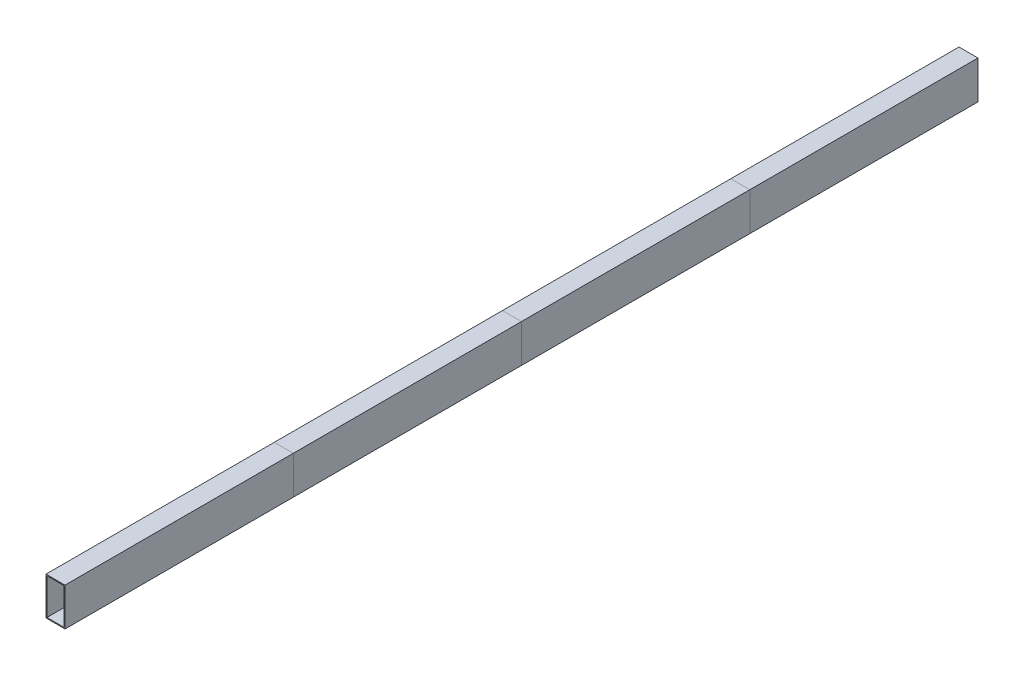
ISO-10303-21;
HEADER;
FILE_DESCRIPTION(('STEP AP214'),'2;1');
FILE_NAME('part.step','',(''),(''),'','','');
FILE_SCHEMA(('AUTOMOTIVE_DESIGN { 1 0 10303 214 1 1 1 1 }'));
ENDSEC;
DATA;
#1=APPLICATION_CONTEXT('core data for automotive mechanical design processes');
#2=APPLICATION_PROTOCOL_DEFINITION('international standard','automotive_design',2000,#1);
#3=PRODUCT_CONTEXT('',#1,'mechanical');
#4=PRODUCT('Part','Part','',(#3));
#5=PRODUCT_RELATED_PRODUCT_CATEGORY('part','',(#4));
#6=PRODUCT_DEFINITION_FORMATION('','',#4);
#7=PRODUCT_DEFINITION_CONTEXT('part definition',#1,'design');
#8=PRODUCT_DEFINITION('design','',#6,#7);
#9=PRODUCT_DEFINITION_SHAPE('','',#8);
#10=(LENGTH_UNIT() NAMED_UNIT(*) SI_UNIT(.MILLI.,.METRE.));
#11=(NAMED_UNIT(*) PLANE_ANGLE_UNIT() SI_UNIT($,.RADIAN.));
#12=(NAMED_UNIT(*) SI_UNIT($,.STERADIAN.) SOLID_ANGLE_UNIT());
#13=UNCERTAINTY_MEASURE_WITH_UNIT(LENGTH_MEASURE(1.E-05),#10,'distance_accuracy_value','');
#14=(GEOMETRIC_REPRESENTATION_CONTEXT(3) GLOBAL_UNCERTAINTY_ASSIGNED_CONTEXT((#13)) GLOBAL_UNIT_ASSIGNED_CONTEXT((#10,
#11,#12)) REPRESENTATION_CONTEXT('',''));
#15=CARTESIAN_POINT('',(0.,0.,0.));
#16=DIRECTION('',(0.,0.,1.));
#17=DIRECTION('',(1.,0.,0.));
#18=AXIS2_PLACEMENT_3D('',#15,#16,#17);
#19=CARTESIAN_POINT('',(0.,0.,4800.));
#20=DIRECTION('',(0.,0.,1.));
#21=DIRECTION('',(1.,0.,0.));
#22=AXIS2_PLACEMENT_3D('',#19,#20,#21);
#23=PLANE('',#22);
#24=DIRECTION('',(0.,1.,0.));
#25=VECTOR('',#24,1.);
#26=CARTESIAN_POINT('',(50.,0.,4800.));
#27=LINE('',#26,#25);
#28=CARTESIAN_POINT('',(50.,-100.,4800.));
#29=VERTEX_POINT('',#28);
#30=CARTESIAN_POINT('',(50.,100.,4800.));
#31=VERTEX_POINT('',#30);
#32=EDGE_CURVE('E150',#29,#31,#27,.T.);
#33=ORIENTED_EDGE('',*,*,#32,.T.);
#34=DIRECTION('',(-1.,0.,0.));
#35=VECTOR('',#34,1.);
#36=CARTESIAN_POINT('',(0.,100.,4800.));
#37=LINE('',#36,#35);
#38=CARTESIAN_POINT('',(-50.,100.,4800.));
#39=VERTEX_POINT('',#38);
#40=EDGE_CURVE('E153',#31,#39,#37,.T.);
#41=ORIENTED_EDGE('',*,*,#40,.T.);
#42=DIRECTION('',(0.,-1.,0.));
#43=VECTOR('',#42,1.);
#44=CARTESIAN_POINT('',(-50.,0.,4800.));
#45=LINE('',#44,#43);
#46=CARTESIAN_POINT('',(-50.,-100.,4800.));
#47=VERTEX_POINT('',#46);
#48=EDGE_CURVE('E156',#39,#47,#45,.T.);
#49=ORIENTED_EDGE('',*,*,#48,.T.);
#50=DIRECTION('',(1.,0.,0.));
#51=VECTOR('',#50,1.);
#52=CARTESIAN_POINT('',(0.,-100.,4800.));
#53=LINE('',#52,#51);
#54=EDGE_CURVE('E158',#47,#29,#53,.T.);
#55=ORIENTED_EDGE('',*,*,#54,.T.);
#56=EDGE_LOOP('',(#33,#41,#49,#55));
#57=FACE_BOUND('',#56,.T.);
#58=DIRECTION('',(-1.,0.,0.));
#59=VECTOR('',#58,1.);
#60=CARTESIAN_POINT('',(0.,95.,4800.));
#61=LINE('',#60,#59);
#62=CARTESIAN_POINT('',(45.,95.,4800.));
#63=VERTEX_POINT('',#62);
#64=CARTESIAN_POINT('',(-45.,95.,4800.));
#65=VERTEX_POINT('',#64);
#66=EDGE_CURVE('E122',#63,#65,#61,.T.);
#67=ORIENTED_EDGE('',*,*,#66,.F.);
#68=DIRECTION('',(0.,1.,0.));
#69=VECTOR('',#68,1.);
#70=CARTESIAN_POINT('',(45.,0.,4800.));
#71=LINE('',#70,#69);
#72=CARTESIAN_POINT('',(45.,-95.,4800.));
#73=VERTEX_POINT('',#72);
#74=EDGE_CURVE('E114',#73,#63,#71,.T.);
#75=ORIENTED_EDGE('',*,*,#74,.F.);
#76=DIRECTION('',(1.,0.,0.));
#77=VECTOR('',#76,1.);
#78=CARTESIAN_POINT('',(0.,-95.,4800.));
#79=LINE('',#78,#77);
#80=CARTESIAN_POINT('',(-45.,-95.,4800.));
#81=VERTEX_POINT('',#80);
#82=EDGE_CURVE('E136',#81,#73,#79,.T.);
#83=ORIENTED_EDGE('',*,*,#82,.F.);
#84=DIRECTION('',(0.,-1.,0.));
#85=VECTOR('',#84,1.);
#86=CARTESIAN_POINT('',(-45.,0.,4800.));
#87=LINE('',#86,#85);
#88=EDGE_CURVE('E134',#65,#81,#87,.T.);
#89=ORIENTED_EDGE('',*,*,#88,.F.);
#90=EDGE_LOOP('',(#67,#75,#83,#89));
#91=FACE_BOUND('',#90,.T.);
#92=ADVANCED_FACE('F49',(#57,#91),#23,.T.);
#93=CARTESIAN_POINT('',(0.,0.,3600.));
#94=DIRECTION('',(0.,0.,1.));
#95=DIRECTION('',(1.,0.,0.));
#96=AXIS2_PLACEMENT_3D('',#93,#94,#95);
#97=PLANE('',#96);
#98=DIRECTION('',(0.,1.,0.));
#99=VECTOR('',#98,1.);
#100=CARTESIAN_POINT('',(50.,0.,3600.));
#101=LINE('',#100,#99);
#102=CARTESIAN_POINT('',(50.,-100.,3600.));
#103=VERTEX_POINT('',#102);
#104=CARTESIAN_POINT('',(50.,100.,3600.));
#105=VERTEX_POINT('',#104);
#106=EDGE_CURVE('E130',#103,#105,#101,.T.);
#107=ORIENTED_EDGE('',*,*,#106,.F.);
#108=DIRECTION('',(1.,0.,0.));
#109=VECTOR('',#108,1.);
#110=CARTESIAN_POINT('',(0.,-100.,3600.));
#111=LINE('',#110,#109);
#112=CARTESIAN_POINT('',(-50.,-100.,3600.));
#113=VERTEX_POINT('',#112);
#114=EDGE_CURVE('E154',#113,#103,#111,.T.);
#115=ORIENTED_EDGE('',*,*,#114,.F.);
#116=DIRECTION('',(0.,-1.,0.));
#117=VECTOR('',#116,1.);
#118=CARTESIAN_POINT('',(-50.,0.,3600.));
#119=LINE('',#118,#117);
#120=CARTESIAN_POINT('',(-50.,100.,3600.));
#121=VERTEX_POINT('',#120);
#122=EDGE_CURVE('E165',#121,#113,#119,.T.);
#123=ORIENTED_EDGE('',*,*,#122,.F.);
#124=DIRECTION('',(-1.,0.,0.));
#125=VECTOR('',#124,1.);
#126=CARTESIAN_POINT('',(0.,100.,3600.));
#127=LINE('',#126,#125);
#128=EDGE_CURVE('E163',#105,#121,#127,.T.);
#129=ORIENTED_EDGE('',*,*,#128,.F.);
#130=EDGE_LOOP('',(#107,#115,#123,#129));
#131=FACE_BOUND('',#130,.T.);
#132=DIRECTION('',(0.,1.,0.));
#133=VECTOR('',#132,1.);
#134=CARTESIAN_POINT('',(45.,0.,3600.));
#135=LINE('',#134,#133);
#136=CARTESIAN_POINT('',(45.,-95.,3600.));
#137=VERTEX_POINT('',#136);
#138=CARTESIAN_POINT('',(45.,95.,3600.));
#139=VERTEX_POINT('',#138);
#140=EDGE_CURVE('E72',#137,#139,#135,.T.);
#141=ORIENTED_EDGE('',*,*,#140,.T.);
#142=DIRECTION('',(-1.,0.,0.));
#143=VECTOR('',#142,1.);
#144=CARTESIAN_POINT('',(0.,95.,3600.));
#145=LINE('',#144,#143);
#146=CARTESIAN_POINT('',(-45.,95.,3600.));
#147=VERTEX_POINT('',#146);
#148=EDGE_CURVE('E129',#139,#147,#145,.T.);
#149=ORIENTED_EDGE('',*,*,#148,.T.);
#150=DIRECTION('',(0.,-1.,0.));
#151=VECTOR('',#150,1.);
#152=CARTESIAN_POINT('',(-45.,0.,3600.));
#153=LINE('',#152,#151);
#154=CARTESIAN_POINT('',(-45.,-95.,3600.));
#155=VERTEX_POINT('',#154);
#156=EDGE_CURVE('E142',#147,#155,#153,.T.);
#157=ORIENTED_EDGE('',*,*,#156,.T.);
#158=DIRECTION('',(1.,0.,0.));
#159=VECTOR('',#158,1.);
#160=CARTESIAN_POINT('',(0.,-95.,3600.));
#161=LINE('',#160,#159);
#162=EDGE_CURVE('E123',#155,#137,#161,.T.);
#163=ORIENTED_EDGE('',*,*,#162,.T.);
#164=EDGE_LOOP('',(#141,#149,#157,#163));
#165=FACE_BOUND('',#164,.T.);
#166=ADVANCED_FACE('F183',(#131,#165),#97,.F.);
#167=CARTESIAN_POINT('',(50.,0.,4800.));
#168=DIRECTION('',(-1.,0.,0.));
#169=DIRECTION('',(0.,0.,1.));
#170=AXIS2_PLACEMENT_3D('',#167,#168,#169);
#171=PLANE('',#170);
#172=ORIENTED_EDGE('',*,*,#106,.T.);
#173=DIRECTION('',(0.,0.,-1.));
#174=VECTOR('',#173,1.);
#175=CARTESIAN_POINT('',(50.,100.,4800.));
#176=LINE('',#175,#174);
#177=EDGE_CURVE('E12',#31,#105,#176,.T.);
#178=ORIENTED_EDGE('',*,*,#177,.F.);
#179=ORIENTED_EDGE('',*,*,#32,.F.);
#180=DIRECTION('',(0.,0.,-1.));
#181=VECTOR('',#180,1.);
#182=CARTESIAN_POINT('',(50.,-100.,4800.));
#183=LINE('',#182,#181);
#184=EDGE_CURVE('E160',#29,#103,#183,.T.);
#185=ORIENTED_EDGE('',*,*,#184,.T.);
#186=EDGE_LOOP('',(#172,#178,#179,#185));
#187=FACE_BOUND('',#186,.T.);
#188=ADVANCED_FACE('F51',(#187),#171,.F.);
#189=CARTESIAN_POINT('',(0.,100.,4800.));
#190=DIRECTION('',(0.,-1.,0.));
#191=DIRECTION('',(0.,0.,-1.));
#192=AXIS2_PLACEMENT_3D('',#189,#190,#191);
#193=PLANE('',#192);
#194=ORIENTED_EDGE('',*,*,#128,.T.);
#195=DIRECTION('',(0.,0.,-1.));
#196=VECTOR('',#195,1.);
#197=CARTESIAN_POINT('',(-50.,100.,4800.));
#198=LINE('',#197,#196);
#199=EDGE_CURVE('E57',#39,#121,#198,.T.);
#200=ORIENTED_EDGE('',*,*,#199,.F.);
#201=ORIENTED_EDGE('',*,*,#40,.F.);
#202=ORIENTED_EDGE('',*,*,#177,.T.);
#203=EDGE_LOOP('',(#194,#200,#201,#202));
#204=FACE_BOUND('',#203,.T.);
#205=ADVANCED_FACE('F193',(#204),#193,.F.);
#206=CARTESIAN_POINT('',(-50.,0.,4800.));
#207=DIRECTION('',(1.,0.,0.));
#208=DIRECTION('',(0.,0.,-1.));
#209=AXIS2_PLACEMENT_3D('',#206,#207,#208);
#210=PLANE('',#209);
#211=ORIENTED_EDGE('',*,*,#122,.T.);
#212=DIRECTION('',(0.,0.,-1.));
#213=VECTOR('',#212,1.);
#214=CARTESIAN_POINT('',(-50.,-100.,4800.));
#215=LINE('',#214,#213);
#216=EDGE_CURVE('E170',#47,#113,#215,.T.);
#217=ORIENTED_EDGE('',*,*,#216,.F.);
#218=ORIENTED_EDGE('',*,*,#48,.F.);
#219=ORIENTED_EDGE('',*,*,#199,.T.);
#220=EDGE_LOOP('',(#211,#217,#218,#219));
#221=FACE_BOUND('',#220,.T.);
#222=ADVANCED_FACE('F177',(#221),#210,.F.);
#223=CARTESIAN_POINT('',(0.,-100.,4800.));
#224=DIRECTION('',(0.,1.,0.));
#225=DIRECTION('',(0.,0.,1.));
#226=AXIS2_PLACEMENT_3D('',#223,#224,#225);
#227=PLANE('',#226);
#228=ORIENTED_EDGE('',*,*,#114,.T.);
#229=ORIENTED_EDGE('',*,*,#184,.F.);
#230=ORIENTED_EDGE('',*,*,#54,.F.);
#231=ORIENTED_EDGE('',*,*,#216,.T.);
#232=EDGE_LOOP('',(#228,#229,#230,#231));
#233=FACE_BOUND('',#232,.T.);
#234=ADVANCED_FACE('F187',(#233),#227,.F.);
#235=CARTESIAN_POINT('',(45.,0.,4800.));
#236=DIRECTION('',(-1.,0.,0.));
#237=DIRECTION('',(0.,0.,1.));
#238=AXIS2_PLACEMENT_3D('',#235,#236,#237);
#239=PLANE('',#238);
#240=ORIENTED_EDGE('',*,*,#140,.F.);
#241=DIRECTION('',(0.,0.,-1.));
#242=VECTOR('',#241,1.);
#243=CARTESIAN_POINT('',(45.,-95.,4800.));
#244=LINE('',#243,#242);
#245=EDGE_CURVE('E118',#73,#137,#244,.T.);
#246=ORIENTED_EDGE('',*,*,#245,.F.);
#247=ORIENTED_EDGE('',*,*,#74,.T.);
#248=DIRECTION('',(0.,0.,-1.));
#249=VECTOR('',#248,1.);
#250=CARTESIAN_POINT('',(45.,95.,4800.));
#251=LINE('',#250,#249);
#252=EDGE_CURVE('E117',#63,#139,#251,.T.);
#253=ORIENTED_EDGE('',*,*,#252,.T.);
#254=EDGE_LOOP('',(#240,#246,#247,#253));
#255=FACE_BOUND('',#254,.T.);
#256=ADVANCED_FACE('F116',(#255),#239,.T.);
#257=CARTESIAN_POINT('',(0.,95.,4800.));
#258=DIRECTION('',(0.,-1.,0.));
#259=DIRECTION('',(0.,0.,-1.));
#260=AXIS2_PLACEMENT_3D('',#257,#258,#259);
#261=PLANE('',#260);
#262=ORIENTED_EDGE('',*,*,#148,.F.);
#263=ORIENTED_EDGE('',*,*,#252,.F.);
#264=ORIENTED_EDGE('',*,*,#66,.T.);
#265=DIRECTION('',(0.,0.,-1.));
#266=VECTOR('',#265,1.);
#267=CARTESIAN_POINT('',(-45.,95.,4800.));
#268=LINE('',#267,#266);
#269=EDGE_CURVE('E131',#65,#147,#268,.T.);
#270=ORIENTED_EDGE('',*,*,#269,.T.);
#271=EDGE_LOOP('',(#262,#263,#264,#270));
#272=FACE_BOUND('',#271,.T.);
#273=ADVANCED_FACE('F126',(#272),#261,.T.);
#274=CARTESIAN_POINT('',(-45.,0.,4800.));
#275=DIRECTION('',(1.,0.,0.));
#276=DIRECTION('',(0.,0.,-1.));
#277=AXIS2_PLACEMENT_3D('',#274,#275,#276);
#278=PLANE('',#277);
#279=ORIENTED_EDGE('',*,*,#156,.F.);
#280=ORIENTED_EDGE('',*,*,#269,.F.);
#281=ORIENTED_EDGE('',*,*,#88,.T.);
#282=DIRECTION('',(0.,0.,-1.));
#283=VECTOR('',#282,1.);
#284=CARTESIAN_POINT('',(-45.,-95.,4800.));
#285=LINE('',#284,#283);
#286=EDGE_CURVE('E64',#81,#155,#285,.T.);
#287=ORIENTED_EDGE('',*,*,#286,.T.);
#288=EDGE_LOOP('',(#279,#280,#281,#287));
#289=FACE_BOUND('',#288,.T.);
#290=ADVANCED_FACE('F216',(#289),#278,.T.);
#291=CARTESIAN_POINT('',(0.,-95.,4800.));
#292=DIRECTION('',(0.,1.,0.));
#293=DIRECTION('',(0.,0.,1.));
#294=AXIS2_PLACEMENT_3D('',#291,#292,#293);
#295=PLANE('',#294);
#296=ORIENTED_EDGE('',*,*,#162,.F.);
#297=ORIENTED_EDGE('',*,*,#286,.F.);
#298=ORIENTED_EDGE('',*,*,#82,.T.);
#299=ORIENTED_EDGE('',*,*,#245,.T.);
#300=EDGE_LOOP('',(#296,#297,#298,#299));
#301=FACE_BOUND('',#300,.T.);
#302=ADVANCED_FACE('F220',(#301),#295,.T.);
#303=CLOSED_SHELL('',(#92,#166,#188,#205,#222,#234,#256,#273,#290,#302));
#304=MANIFOLD_SOLID_BREP('B2',#303);
#305=CARTESIAN_POINT('',(-50.,0.,3600.));
#306=DIRECTION('',(-1.,0.,0.));
#307=DIRECTION('',(0.,0.,1.));
#308=AXIS2_PLACEMENT_3D('',#305,#306,#307);
#309=PLANE('',#308);
#310=DIRECTION('',(0.,1.,0.));
#311=VECTOR('',#310,1.);
#312=CARTESIAN_POINT('',(-50.,0.,2400.));
#313=LINE('',#312,#311);
#314=CARTESIAN_POINT('',(-50.,-100.,2400.));
#315=VERTEX_POINT('',#314);
#316=CARTESIAN_POINT('',(-50.,100.,2400.));
#317=VERTEX_POINT('',#316);
#318=EDGE_CURVE('E386',#315,#317,#313,.T.);
#319=ORIENTED_EDGE('',*,*,#318,.F.);
#320=DIRECTION('',(0.,0.,-1.));
#321=VECTOR('',#320,1.);
#322=CARTESIAN_POINT('',(-50.,-100.,3600.));
#323=LINE('',#322,#321);
#324=CARTESIAN_POINT('',(-50.,-100.,3600.));
#325=VERTEX_POINT('',#324);
#326=EDGE_CURVE('E47',#325,#315,#323,.T.);
#327=ORIENTED_EDGE('',*,*,#326,.F.);
#328=DIRECTION('',(0.,1.,0.));
#329=VECTOR('',#328,1.);
#330=CARTESIAN_POINT('',(-50.,0.,3600.));
#331=LINE('',#330,#329);
#332=CARTESIAN_POINT('',(-50.,100.,3600.));
#333=VERTEX_POINT('',#332);
#334=EDGE_CURVE('E390',#325,#333,#331,.T.);
#335=ORIENTED_EDGE('',*,*,#334,.T.);
#336=DIRECTION('',(0.,0.,-1.));
#337=VECTOR('',#336,1.);
#338=CARTESIAN_POINT('',(-50.,100.,3600.));
#339=LINE('',#338,#337);
#340=EDGE_CURVE('E291',#333,#317,#339,.T.);
#341=ORIENTED_EDGE('',*,*,#340,.T.);
#342=EDGE_LOOP('',(#319,#327,#335,#341));
#343=FACE_BOUND('',#342,.T.);
#344=ADVANCED_FACE('F288',(#343),#309,.T.);
#345=CARTESIAN_POINT('',(0.,-100.,3600.));
#346=DIRECTION('',(0.,-1.,0.));
#347=DIRECTION('',(0.,0.,-1.));
#348=AXIS2_PLACEMENT_3D('',#345,#346,#347);
#349=PLANE('',#348);
#350=DIRECTION('',(-1.,0.,0.));
#351=VECTOR('',#350,1.);
#352=CARTESIAN_POINT('',(0.,-100.,2400.));
#353=LINE('',#352,#351);
#354=CARTESIAN_POINT('',(50.,-100.,2400.));
#355=VERTEX_POINT('',#354);
#356=EDGE_CURVE('E394',#355,#315,#353,.T.);
#357=ORIENTED_EDGE('',*,*,#356,.F.);
#358=DIRECTION('',(0.,0.,-1.));
#359=VECTOR('',#358,1.);
#360=CARTESIAN_POINT('',(50.,-100.,3600.));
#361=LINE('',#360,#359);
#362=CARTESIAN_POINT('',(50.,-100.,3600.));
#363=VERTEX_POINT('',#362);
#364=EDGE_CURVE('E296',#363,#355,#361,.T.);
#365=ORIENTED_EDGE('',*,*,#364,.F.);
#366=DIRECTION('',(-1.,0.,0.));
#367=VECTOR('',#366,1.);
#368=CARTESIAN_POINT('',(0.,-100.,3600.));
#369=LINE('',#368,#367);
#370=EDGE_CURVE('E400',#363,#325,#369,.T.);
#371=ORIENTED_EDGE('',*,*,#370,.T.);
#372=ORIENTED_EDGE('',*,*,#326,.T.);
#373=EDGE_LOOP('',(#357,#365,#371,#372));
#374=FACE_BOUND('',#373,.T.);
#375=ADVANCED_FACE('F426',(#374),#349,.T.);
#376=CARTESIAN_POINT('',(50.,0.,3600.));
#377=DIRECTION('',(1.,0.,0.));
#378=DIRECTION('',(0.,0.,-1.));
#379=AXIS2_PLACEMENT_3D('',#376,#377,#378);
#380=PLANE('',#379);
#381=DIRECTION('',(0.,-1.,0.));
#382=VECTOR('',#381,1.);
#383=CARTESIAN_POINT('',(50.,0.,2400.));
#384=LINE('',#383,#382);
#385=CARTESIAN_POINT('',(50.,100.,2400.));
#386=VERTEX_POINT('',#385);
#387=EDGE_CURVE('E408',#386,#355,#384,.T.);
#388=ORIENTED_EDGE('',*,*,#387,.F.);
#389=DIRECTION('',(0.,0.,-1.));
#390=VECTOR('',#389,1.);
#391=CARTESIAN_POINT('',(50.,100.,3600.));
#392=LINE('',#391,#390);
#393=CARTESIAN_POINT('',(50.,100.,3600.));
#394=VERTEX_POINT('',#393);
#395=EDGE_CURVE('E413',#394,#386,#392,.T.);
#396=ORIENTED_EDGE('',*,*,#395,.F.);
#397=DIRECTION('',(0.,-1.,0.));
#398=VECTOR('',#397,1.);
#399=CARTESIAN_POINT('',(50.,0.,3600.));
#400=LINE('',#399,#398);
#401=EDGE_CURVE('E397',#394,#363,#400,.T.);
#402=ORIENTED_EDGE('',*,*,#401,.T.);
#403=ORIENTED_EDGE('',*,*,#364,.T.);
#404=EDGE_LOOP('',(#388,#396,#402,#403));
#405=FACE_BOUND('',#404,.T.);
#406=ADVANCED_FACE('F430',(#405),#380,.T.);
#407=CARTESIAN_POINT('',(0.,100.,3600.));
#408=DIRECTION('',(0.,1.,0.));
#409=DIRECTION('',(0.,0.,1.));
#410=AXIS2_PLACEMENT_3D('',#407,#408,#409);
#411=PLANE('',#410);
#412=DIRECTION('',(1.,0.,0.));
#413=VECTOR('',#412,1.);
#414=CARTESIAN_POINT('',(0.,100.,2400.));
#415=LINE('',#414,#413);
#416=EDGE_CURVE('E405',#317,#386,#415,.T.);
#417=ORIENTED_EDGE('',*,*,#416,.F.);
#418=ORIENTED_EDGE('',*,*,#340,.F.);
#419=DIRECTION('',(1.,0.,0.));
#420=VECTOR('',#419,1.);
#421=CARTESIAN_POINT('',(0.,100.,3600.));
#422=LINE('',#421,#420);
#423=EDGE_CURVE('E393',#333,#394,#422,.T.);
#424=ORIENTED_EDGE('',*,*,#423,.T.);
#425=ORIENTED_EDGE('',*,*,#395,.T.);
#426=EDGE_LOOP('',(#417,#418,#424,#425));
#427=FACE_BOUND('',#426,.T.);
#428=ADVANCED_FACE('F421',(#427),#411,.T.);
#429=CARTESIAN_POINT('',(0.,0.,3600.));
#430=DIRECTION('',(0.,0.,-1.));
#431=DIRECTION('',(-1.,0.,0.));
#432=AXIS2_PLACEMENT_3D('',#429,#430,#431);
#433=PLANE('',#432);
#434=DIRECTION('',(-1.,0.,0.));
#435=VECTOR('',#434,1.);
#436=CARTESIAN_POINT('',(0.,-95.,3600.));
#437=LINE('',#436,#435);
#438=CARTESIAN_POINT('',(45.,-95.,3600.));
#439=VERTEX_POINT('',#438);
#440=CARTESIAN_POINT('',(-45.,-95.,3600.));
#441=VERTEX_POINT('',#440);
#442=EDGE_CURVE('E361',#439,#441,#437,.T.);
#443=ORIENTED_EDGE('',*,*,#442,.T.);
#444=DIRECTION('',(0.,1.,0.));
#445=VECTOR('',#444,1.);
#446=CARTESIAN_POINT('',(-45.,0.,3600.));
#447=LINE('',#446,#445);
#448=CARTESIAN_POINT('',(-45.,95.,3600.));
#449=VERTEX_POINT('',#448);
#450=EDGE_CURVE('E355',#441,#449,#447,.T.);
#451=ORIENTED_EDGE('',*,*,#450,.T.);
#452=DIRECTION('',(1.,0.,0.));
#453=VECTOR('',#452,1.);
#454=CARTESIAN_POINT('',(0.,95.,3600.));
#455=LINE('',#454,#453);
#456=CARTESIAN_POINT('',(45.,95.,3600.));
#457=VERTEX_POINT('',#456);
#458=EDGE_CURVE('E364',#449,#457,#455,.T.);
#459=ORIENTED_EDGE('',*,*,#458,.T.);
#460=DIRECTION('',(0.,-1.,0.));
#461=VECTOR('',#460,1.);
#462=CARTESIAN_POINT('',(45.,0.,3600.));
#463=LINE('',#462,#461);
#464=EDGE_CURVE('E304',#457,#439,#463,.T.);
#465=ORIENTED_EDGE('',*,*,#464,.T.);
#466=EDGE_LOOP('',(#443,#451,#459,#465));
#467=FACE_BOUND('',#466,.T.);
#468=ORIENTED_EDGE('',*,*,#334,.F.);
#469=ORIENTED_EDGE('',*,*,#370,.F.);
#470=ORIENTED_EDGE('',*,*,#401,.F.);
#471=ORIENTED_EDGE('',*,*,#423,.F.);
#472=EDGE_LOOP('',(#468,#469,#470,#471));
#473=FACE_BOUND('',#472,.T.);
#474=ADVANCED_FACE('F368',(#467,#473),#433,.F.);
#475=CARTESIAN_POINT('',(0.,0.,2400.));
#476=DIRECTION('',(0.,0.,-1.));
#477=DIRECTION('',(-1.,0.,0.));
#478=AXIS2_PLACEMENT_3D('',#475,#476,#477);
#479=PLANE('',#478);
#480=DIRECTION('',(0.,1.,0.));
#481=VECTOR('',#480,1.);
#482=CARTESIAN_POINT('',(-45.,0.,2400.));
#483=LINE('',#482,#481);
#484=CARTESIAN_POINT('',(-45.,-95.,2400.));
#485=VERTEX_POINT('',#484);
#486=CARTESIAN_POINT('',(-45.,95.,2400.));
#487=VERTEX_POINT('',#486);
#488=EDGE_CURVE('E312',#485,#487,#483,.T.);
#489=ORIENTED_EDGE('',*,*,#488,.F.);
#490=DIRECTION('',(-1.,0.,0.));
#491=VECTOR('',#490,1.);
#492=CARTESIAN_POINT('',(0.,-95.,2400.));
#493=LINE('',#492,#491);
#494=CARTESIAN_POINT('',(45.,-95.,2400.));
#495=VERTEX_POINT('',#494);
#496=EDGE_CURVE('E371',#495,#485,#493,.T.);
#497=ORIENTED_EDGE('',*,*,#496,.F.);
#498=DIRECTION('',(0.,-1.,0.));
#499=VECTOR('',#498,1.);
#500=CARTESIAN_POINT('',(45.,0.,2400.));
#501=LINE('',#500,#499);
#502=CARTESIAN_POINT('',(45.,95.,2400.));
#503=VERTEX_POINT('',#502);
#504=EDGE_CURVE('E374',#503,#495,#501,.T.);
#505=ORIENTED_EDGE('',*,*,#504,.F.);
#506=DIRECTION('',(1.,0.,0.));
#507=VECTOR('',#506,1.);
#508=CARTESIAN_POINT('',(0.,95.,2400.));
#509=LINE('',#508,#507);
#510=EDGE_CURVE('E380',#487,#503,#509,.T.);
#511=ORIENTED_EDGE('',*,*,#510,.F.);
#512=EDGE_LOOP('',(#489,#497,#505,#511));
#513=FACE_BOUND('',#512,.T.);
#514=ORIENTED_EDGE('',*,*,#318,.T.);
#515=ORIENTED_EDGE('',*,*,#416,.T.);
#516=ORIENTED_EDGE('',*,*,#387,.T.);
#517=ORIENTED_EDGE('',*,*,#356,.T.);
#518=EDGE_LOOP('',(#514,#515,#516,#517));
#519=FACE_BOUND('',#518,.T.);
#520=ADVANCED_FACE('F423',(#513,#519),#479,.T.);
#521=CARTESIAN_POINT('',(-45.,0.,3600.));
#522=DIRECTION('',(-1.,0.,0.));
#523=DIRECTION('',(0.,0.,1.));
#524=AXIS2_PLACEMENT_3D('',#521,#522,#523);
#525=PLANE('',#524);
#526=ORIENTED_EDGE('',*,*,#488,.T.);
#527=DIRECTION('',(0.,0.,-1.));
#528=VECTOR('',#527,1.);
#529=CARTESIAN_POINT('',(-45.,95.,3600.));
#530=LINE('',#529,#528);
#531=EDGE_CURVE('E351',#449,#487,#530,.T.);
#532=ORIENTED_EDGE('',*,*,#531,.F.);
#533=ORIENTED_EDGE('',*,*,#450,.F.);
#534=DIRECTION('',(0.,0.,-1.));
#535=VECTOR('',#534,1.);
#536=CARTESIAN_POINT('',(-45.,-95.,3600.));
#537=LINE('',#536,#535);
#538=EDGE_CURVE('E384',#441,#485,#537,.T.);
#539=ORIENTED_EDGE('',*,*,#538,.T.);
#540=EDGE_LOOP('',(#526,#532,#533,#539));
#541=FACE_BOUND('',#540,.T.);
#542=ADVANCED_FACE('F353',(#541),#525,.F.);
#543=CARTESIAN_POINT('',(0.,-95.,3600.));
#544=DIRECTION('',(0.,-1.,0.));
#545=DIRECTION('',(0.,0.,-1.));
#546=AXIS2_PLACEMENT_3D('',#543,#544,#545);
#547=PLANE('',#546);
#548=ORIENTED_EDGE('',*,*,#496,.T.);
#549=ORIENTED_EDGE('',*,*,#538,.F.);
#550=ORIENTED_EDGE('',*,*,#442,.F.);
#551=DIRECTION('',(0.,0.,-1.));
#552=VECTOR('',#551,1.);
#553=CARTESIAN_POINT('',(45.,-95.,3600.));
#554=LINE('',#553,#552);
#555=EDGE_CURVE('E387',#439,#495,#554,.T.);
#556=ORIENTED_EDGE('',*,*,#555,.T.);
#557=EDGE_LOOP('',(#548,#549,#550,#556));
#558=FACE_BOUND('',#557,.T.);
#559=ADVANCED_FACE('F481',(#558),#547,.F.);
#560=CARTESIAN_POINT('',(45.,0.,3600.));
#561=DIRECTION('',(1.,0.,0.));
#562=DIRECTION('',(0.,0.,-1.));
#563=AXIS2_PLACEMENT_3D('',#560,#561,#562);
#564=PLANE('',#563);
#565=ORIENTED_EDGE('',*,*,#504,.T.);
#566=ORIENTED_EDGE('',*,*,#555,.F.);
#567=ORIENTED_EDGE('',*,*,#464,.F.);
#568=DIRECTION('',(0.,0.,-1.));
#569=VECTOR('',#568,1.);
#570=CARTESIAN_POINT('',(45.,95.,3600.));
#571=LINE('',#570,#569);
#572=EDGE_CURVE('E360',#457,#503,#571,.T.);
#573=ORIENTED_EDGE('',*,*,#572,.T.);
#574=EDGE_LOOP('',(#565,#566,#567,#573));
#575=FACE_BOUND('',#574,.T.);
#576=ADVANCED_FACE('F490',(#575),#564,.F.);
#577=CARTESIAN_POINT('',(0.,95.,3600.));
#578=DIRECTION('',(0.,1.,0.));
#579=DIRECTION('',(0.,0.,1.));
#580=AXIS2_PLACEMENT_3D('',#577,#578,#579);
#581=PLANE('',#580);
#582=ORIENTED_EDGE('',*,*,#510,.T.);
#583=ORIENTED_EDGE('',*,*,#572,.F.);
#584=ORIENTED_EDGE('',*,*,#458,.F.);
#585=ORIENTED_EDGE('',*,*,#531,.T.);
#586=EDGE_LOOP('',(#582,#583,#584,#585));
#587=FACE_BOUND('',#586,.T.);
#588=ADVANCED_FACE('F365',(#587),#581,.F.);
#589=CLOSED_SHELL('',(#344,#375,#406,#428,#474,#520,#542,#559,#576,#588));
#590=MANIFOLD_SOLID_BREP('B6',#589);
#591=CARTESIAN_POINT('',(0.,0.,2400.));
#592=DIRECTION('',(0.,0.,1.));
#593=DIRECTION('',(1.,0.,0.));
#594=AXIS2_PLACEMENT_3D('',#591,#592,#593);
#595=PLANE('',#594);
#596=DIRECTION('',(0.,1.,0.));
#597=VECTOR('',#596,1.);
#598=CARTESIAN_POINT('',(50.,0.,2400.));
#599=LINE('',#598,#597);
#600=CARTESIAN_POINT('',(50.,-100.,2400.));
#601=VERTEX_POINT('',#600);
#602=CARTESIAN_POINT('',(50.,100.,2400.));
#603=VERTEX_POINT('',#602);
#604=EDGE_CURVE('E628',#601,#603,#599,.T.);
#605=ORIENTED_EDGE('',*,*,#604,.T.);
#606=DIRECTION('',(-1.,0.,0.));
#607=VECTOR('',#606,1.);
#608=CARTESIAN_POINT('',(0.,100.,2400.));
#609=LINE('',#608,#607);
#610=CARTESIAN_POINT('',(-50.,100.,2400.));
#611=VERTEX_POINT('',#610);
#612=EDGE_CURVE('E631',#603,#611,#609,.T.);
#613=ORIENTED_EDGE('',*,*,#612,.T.);
#614=DIRECTION('',(0.,-1.,0.));
#615=VECTOR('',#614,1.);
#616=CARTESIAN_POINT('',(-50.,0.,2400.));
#617=LINE('',#616,#615);
#618=CARTESIAN_POINT('',(-50.,-100.,2400.));
#619=VERTEX_POINT('',#618);
#620=EDGE_CURVE('E634',#611,#619,#617,.T.);
#621=ORIENTED_EDGE('',*,*,#620,.T.);
#622=DIRECTION('',(1.,0.,0.));
#623=VECTOR('',#622,1.);
#624=CARTESIAN_POINT('',(0.,-100.,2400.));
#625=LINE('',#624,#623);
#626=EDGE_CURVE('E636',#619,#601,#625,.T.);
#627=ORIENTED_EDGE('',*,*,#626,.T.);
#628=EDGE_LOOP('',(#605,#613,#621,#627));
#629=FACE_BOUND('',#628,.T.);
#630=DIRECTION('',(-1.,0.,0.));
#631=VECTOR('',#630,1.);
#632=CARTESIAN_POINT('',(0.,95.,2400.));
#633=LINE('',#632,#631);
#634=CARTESIAN_POINT('',(45.,95.,2400.));
#635=VERTEX_POINT('',#634);
#636=CARTESIAN_POINT('',(-45.,95.,2400.));
#637=VERTEX_POINT('',#636);
#638=EDGE_CURVE('E600',#635,#637,#633,.T.);
#639=ORIENTED_EDGE('',*,*,#638,.F.);
#640=DIRECTION('',(0.,1.,0.));
#641=VECTOR('',#640,1.);
#642=CARTESIAN_POINT('',(45.,0.,2400.));
#643=LINE('',#642,#641);
#644=CARTESIAN_POINT('',(45.,-95.,2400.));
#645=VERTEX_POINT('',#644);
#646=EDGE_CURVE('E592',#645,#635,#643,.T.);
#647=ORIENTED_EDGE('',*,*,#646,.F.);
#648=DIRECTION('',(1.,0.,0.));
#649=VECTOR('',#648,1.);
#650=CARTESIAN_POINT('',(0.,-95.,2400.));
#651=LINE('',#650,#649);
#652=CARTESIAN_POINT('',(-45.,-95.,2400.));
#653=VERTEX_POINT('',#652);
#654=EDGE_CURVE('E614',#653,#645,#651,.T.);
#655=ORIENTED_EDGE('',*,*,#654,.F.);
#656=DIRECTION('',(0.,-1.,0.));
#657=VECTOR('',#656,1.);
#658=CARTESIAN_POINT('',(-45.,0.,2400.));
#659=LINE('',#658,#657);
#660=EDGE_CURVE('E612',#637,#653,#659,.T.);
#661=ORIENTED_EDGE('',*,*,#660,.F.);
#662=EDGE_LOOP('',(#639,#647,#655,#661));
#663=FACE_BOUND('',#662,.T.);
#664=ADVANCED_FACE('F527',(#629,#663),#595,.T.);
#665=CARTESIAN_POINT('',(0.,0.,1200.));
#666=DIRECTION('',(0.,0.,1.));
#667=DIRECTION('',(1.,0.,0.));
#668=AXIS2_PLACEMENT_3D('',#665,#666,#667);
#669=PLANE('',#668);
#670=DIRECTION('',(0.,1.,0.));
#671=VECTOR('',#670,1.);
#672=CARTESIAN_POINT('',(50.,0.,1200.));
#673=LINE('',#672,#671);
#674=CARTESIAN_POINT('',(50.,-100.,1200.));
#675=VERTEX_POINT('',#674);
#676=CARTESIAN_POINT('',(50.,100.,1200.));
#677=VERTEX_POINT('',#676);
#678=EDGE_CURVE('E608',#675,#677,#673,.T.);
#679=ORIENTED_EDGE('',*,*,#678,.F.);
#680=DIRECTION('',(1.,0.,0.));
#681=VECTOR('',#680,1.);
#682=CARTESIAN_POINT('',(0.,-100.,1200.));
#683=LINE('',#682,#681);
#684=CARTESIAN_POINT('',(-50.,-100.,1200.));
#685=VERTEX_POINT('',#684);
#686=EDGE_CURVE('E632',#685,#675,#683,.T.);
#687=ORIENTED_EDGE('',*,*,#686,.F.);
#688=DIRECTION('',(0.,-1.,0.));
#689=VECTOR('',#688,1.);
#690=CARTESIAN_POINT('',(-50.,0.,1200.));
#691=LINE('',#690,#689);
#692=CARTESIAN_POINT('',(-50.,100.,1200.));
#693=VERTEX_POINT('',#692);
#694=EDGE_CURVE('E643',#693,#685,#691,.T.);
#695=ORIENTED_EDGE('',*,*,#694,.F.);
#696=DIRECTION('',(-1.,0.,0.));
#697=VECTOR('',#696,1.);
#698=CARTESIAN_POINT('',(0.,100.,1200.));
#699=LINE('',#698,#697);
#700=EDGE_CURVE('E641',#677,#693,#699,.T.);
#701=ORIENTED_EDGE('',*,*,#700,.F.);
#702=EDGE_LOOP('',(#679,#687,#695,#701));
#703=FACE_BOUND('',#702,.T.);
#704=DIRECTION('',(0.,1.,0.));
#705=VECTOR('',#704,1.);
#706=CARTESIAN_POINT('',(45.,0.,1200.));
#707=LINE('',#706,#705);
#708=CARTESIAN_POINT('',(45.,-95.,1200.));
#709=VERTEX_POINT('',#708);
#710=CARTESIAN_POINT('',(45.,95.,1200.));
#711=VERTEX_POINT('',#710);
#712=EDGE_CURVE('E550',#709,#711,#707,.T.);
#713=ORIENTED_EDGE('',*,*,#712,.T.);
#714=DIRECTION('',(-1.,0.,0.));
#715=VECTOR('',#714,1.);
#716=CARTESIAN_POINT('',(0.,95.,1200.));
#717=LINE('',#716,#715);
#718=CARTESIAN_POINT('',(-45.,95.,1200.));
#719=VERTEX_POINT('',#718);
#720=EDGE_CURVE('E607',#711,#719,#717,.T.);
#721=ORIENTED_EDGE('',*,*,#720,.T.);
#722=DIRECTION('',(0.,-1.,0.));
#723=VECTOR('',#722,1.);
#724=CARTESIAN_POINT('',(-45.,0.,1200.));
#725=LINE('',#724,#723);
#726=CARTESIAN_POINT('',(-45.,-95.,1200.));
#727=VERTEX_POINT('',#726);
#728=EDGE_CURVE('E620',#719,#727,#725,.T.);
#729=ORIENTED_EDGE('',*,*,#728,.T.);
#730=DIRECTION('',(1.,0.,0.));
#731=VECTOR('',#730,1.);
#732=CARTESIAN_POINT('',(0.,-95.,1200.));
#733=LINE('',#732,#731);
#734=EDGE_CURVE('E601',#727,#709,#733,.T.);
#735=ORIENTED_EDGE('',*,*,#734,.T.);
#736=EDGE_LOOP('',(#713,#721,#729,#735));
#737=FACE_BOUND('',#736,.T.);
#738=ADVANCED_FACE('F661',(#703,#737),#669,.F.);
#739=CARTESIAN_POINT('',(50.,0.,2400.));
#740=DIRECTION('',(-1.,0.,0.));
#741=DIRECTION('',(0.,0.,1.));
#742=AXIS2_PLACEMENT_3D('',#739,#740,#741);
#743=PLANE('',#742);
#744=ORIENTED_EDGE('',*,*,#678,.T.);
#745=DIRECTION('',(0.,0.,-1.));
#746=VECTOR('',#745,1.);
#747=CARTESIAN_POINT('',(50.,100.,2400.));
#748=LINE('',#747,#746);
#749=EDGE_CURVE('E286',#603,#677,#748,.T.);
#750=ORIENTED_EDGE('',*,*,#749,.F.);
#751=ORIENTED_EDGE('',*,*,#604,.F.);
#752=DIRECTION('',(0.,0.,-1.));
#753=VECTOR('',#752,1.);
#754=CARTESIAN_POINT('',(50.,-100.,2400.));
#755=LINE('',#754,#753);
#756=EDGE_CURVE('E638',#601,#675,#755,.T.);
#757=ORIENTED_EDGE('',*,*,#756,.T.);
#758=EDGE_LOOP('',(#744,#750,#751,#757));
#759=FACE_BOUND('',#758,.T.);
#760=ADVANCED_FACE('F529',(#759),#743,.F.);
#761=CARTESIAN_POINT('',(0.,100.,2400.));
#762=DIRECTION('',(0.,-1.,0.));
#763=DIRECTION('',(0.,0.,-1.));
#764=AXIS2_PLACEMENT_3D('',#761,#762,#763);
#765=PLANE('',#764);
#766=ORIENTED_EDGE('',*,*,#700,.T.);
#767=DIRECTION('',(0.,0.,-1.));
#768=VECTOR('',#767,1.);
#769=CARTESIAN_POINT('',(-50.,100.,2400.));
#770=LINE('',#769,#768);
#771=EDGE_CURVE('E535',#611,#693,#770,.T.);
#772=ORIENTED_EDGE('',*,*,#771,.F.);
#773=ORIENTED_EDGE('',*,*,#612,.F.);
#774=ORIENTED_EDGE('',*,*,#749,.T.);
#775=EDGE_LOOP('',(#766,#772,#773,#774));
#776=FACE_BOUND('',#775,.T.);
#777=ADVANCED_FACE('F671',(#776),#765,.F.);
#778=CARTESIAN_POINT('',(-50.,0.,2400.));
#779=DIRECTION('',(1.,0.,0.));
#780=DIRECTION('',(0.,0.,-1.));
#781=AXIS2_PLACEMENT_3D('',#778,#779,#780);
#782=PLANE('',#781);
#783=ORIENTED_EDGE('',*,*,#694,.T.);
#784=DIRECTION('',(0.,0.,-1.));
#785=VECTOR('',#784,1.);
#786=CARTESIAN_POINT('',(-50.,-100.,2400.));
#787=LINE('',#786,#785);
#788=EDGE_CURVE('E648',#619,#685,#787,.T.);
#789=ORIENTED_EDGE('',*,*,#788,.F.);
#790=ORIENTED_EDGE('',*,*,#620,.F.);
#791=ORIENTED_EDGE('',*,*,#771,.T.);
#792=EDGE_LOOP('',(#783,#789,#790,#791));
#793=FACE_BOUND('',#792,.T.);
#794=ADVANCED_FACE('F655',(#793),#782,.F.);
#795=CARTESIAN_POINT('',(0.,-100.,2400.));
#796=DIRECTION('',(0.,1.,0.));
#797=DIRECTION('',(0.,0.,1.));
#798=AXIS2_PLACEMENT_3D('',#795,#796,#797);
#799=PLANE('',#798);
#800=ORIENTED_EDGE('',*,*,#686,.T.);
#801=ORIENTED_EDGE('',*,*,#756,.F.);
#802=ORIENTED_EDGE('',*,*,#626,.F.);
#803=ORIENTED_EDGE('',*,*,#788,.T.);
#804=EDGE_LOOP('',(#800,#801,#802,#803));
#805=FACE_BOUND('',#804,.T.);
#806=ADVANCED_FACE('F665',(#805),#799,.F.);
#807=CARTESIAN_POINT('',(45.,0.,2400.));
#808=DIRECTION('',(-1.,0.,0.));
#809=DIRECTION('',(0.,0.,1.));
#810=AXIS2_PLACEMENT_3D('',#807,#808,#809);
#811=PLANE('',#810);
#812=ORIENTED_EDGE('',*,*,#712,.F.);
#813=DIRECTION('',(0.,0.,-1.));
#814=VECTOR('',#813,1.);
#815=CARTESIAN_POINT('',(45.,-95.,2400.));
#816=LINE('',#815,#814);
#817=EDGE_CURVE('E596',#645,#709,#816,.T.);
#818=ORIENTED_EDGE('',*,*,#817,.F.);
#819=ORIENTED_EDGE('',*,*,#646,.T.);
#820=DIRECTION('',(0.,0.,-1.));
#821=VECTOR('',#820,1.);
#822=CARTESIAN_POINT('',(45.,95.,2400.));
#823=LINE('',#822,#821);
#824=EDGE_CURVE('E595',#635,#711,#823,.T.);
#825=ORIENTED_EDGE('',*,*,#824,.T.);
#826=EDGE_LOOP('',(#812,#818,#819,#825));
#827=FACE_BOUND('',#826,.T.);
#828=ADVANCED_FACE('F594',(#827),#811,.T.);
#829=CARTESIAN_POINT('',(0.,95.,2400.));
#830=DIRECTION('',(0.,-1.,0.));
#831=DIRECTION('',(0.,0.,-1.));
#832=AXIS2_PLACEMENT_3D('',#829,#830,#831);
#833=PLANE('',#832);
#834=ORIENTED_EDGE('',*,*,#720,.F.);
#835=ORIENTED_EDGE('',*,*,#824,.F.);
#836=ORIENTED_EDGE('',*,*,#638,.T.);
#837=DIRECTION('',(0.,0.,-1.));
#838=VECTOR('',#837,1.);
#839=CARTESIAN_POINT('',(-45.,95.,2400.));
#840=LINE('',#839,#838);
#841=EDGE_CURVE('E609',#637,#719,#840,.T.);
#842=ORIENTED_EDGE('',*,*,#841,.T.);
#843=EDGE_LOOP('',(#834,#835,#836,#842));
#844=FACE_BOUND('',#843,.T.);
#845=ADVANCED_FACE('F604',(#844),#833,.T.);
#846=CARTESIAN_POINT('',(-45.,0.,2400.));
#847=DIRECTION('',(1.,0.,0.));
#848=DIRECTION('',(0.,0.,-1.));
#849=AXIS2_PLACEMENT_3D('',#846,#847,#848);
#850=PLANE('',#849);
#851=ORIENTED_EDGE('',*,*,#728,.F.);
#852=ORIENTED_EDGE('',*,*,#841,.F.);
#853=ORIENTED_EDGE('',*,*,#660,.T.);
#854=DIRECTION('',(0.,0.,-1.));
#855=VECTOR('',#854,1.);
#856=CARTESIAN_POINT('',(-45.,-95.,2400.));
#857=LINE('',#856,#855);
#858=EDGE_CURVE('E542',#653,#727,#857,.T.);
#859=ORIENTED_EDGE('',*,*,#858,.T.);
#860=EDGE_LOOP('',(#851,#852,#853,#859));
#861=FACE_BOUND('',#860,.T.);
#862=ADVANCED_FACE('F694',(#861),#850,.T.);
#863=CARTESIAN_POINT('',(0.,-95.,2400.));
#864=DIRECTION('',(0.,1.,0.));
#865=DIRECTION('',(0.,0.,1.));
#866=AXIS2_PLACEMENT_3D('',#863,#864,#865);
#867=PLANE('',#866);
#868=ORIENTED_EDGE('',*,*,#734,.F.);
#869=ORIENTED_EDGE('',*,*,#858,.F.);
#870=ORIENTED_EDGE('',*,*,#654,.T.);
#871=ORIENTED_EDGE('',*,*,#817,.T.);
#872=EDGE_LOOP('',(#868,#869,#870,#871));
#873=FACE_BOUND('',#872,.T.);
#874=ADVANCED_FACE('F698',(#873),#867,.T.);
#875=CLOSED_SHELL('',(#664,#738,#760,#777,#794,#806,#828,#845,#862,#874));
#876=MANIFOLD_SOLID_BREP('B41',#875);
#877=CARTESIAN_POINT('',(0.,0.,1200.));
#878=DIRECTION('',(0.,0.,-1.));
#879=DIRECTION('',(-1.,0.,0.));
#880=AXIS2_PLACEMENT_3D('',#877,#878,#879);
#881=PLANE('',#880);
#882=DIRECTION('',(0.,1.,0.));
#883=VECTOR('',#882,1.);
#884=CARTESIAN_POINT('',(50.,-100.,1200.));
#885=LINE('',#884,#883);
#886=CARTESIAN_POINT('',(50.,-100.,1200.));
#887=VERTEX_POINT('',#886);
#888=CARTESIAN_POINT('',(50.,100.,1200.));
#889=VERTEX_POINT('',#888);
#890=EDGE_CURVE('E860',#887,#889,#885,.T.);
#891=ORIENTED_EDGE('',*,*,#890,.T.);
#892=DIRECTION('',(-1.,0.,0.));
#893=VECTOR('',#892,1.);
#894=CARTESIAN_POINT('',(-50.,100.,1200.));
#895=LINE('',#894,#893);
#896=CARTESIAN_POINT('',(-50.,100.,1200.));
#897=VERTEX_POINT('',#896);
#898=EDGE_CURVE('E863',#889,#897,#895,.T.);
#899=ORIENTED_EDGE('',*,*,#898,.T.);
#900=DIRECTION('',(0.,-1.,0.));
#901=VECTOR('',#900,1.);
#902=CARTESIAN_POINT('',(-50.,-100.,1200.));
#903=LINE('',#902,#901);
#904=CARTESIAN_POINT('',(-50.,-100.,1200.));
#905=VERTEX_POINT('',#904);
#906=EDGE_CURVE('E866',#897,#905,#903,.T.);
#907=ORIENTED_EDGE('',*,*,#906,.T.);
#908=DIRECTION('',(1.,0.,0.));
#909=VECTOR('',#908,1.);
#910=CARTESIAN_POINT('',(-50.,-100.,1200.));
#911=LINE('',#910,#909);
#912=EDGE_CURVE('E868',#905,#887,#911,.T.);
#913=ORIENTED_EDGE('',*,*,#912,.T.);
#914=EDGE_LOOP('',(#891,#899,#907,#913));
#915=FACE_BOUND('',#914,.T.);
#916=DIRECTION('',(0.,1.,0.));
#917=VECTOR('',#916,1.);
#918=CARTESIAN_POINT('',(45.,-95.,1200.));
#919=LINE('',#918,#917);
#920=CARTESIAN_POINT('',(45.,-95.,1200.));
#921=VERTEX_POINT('',#920);
#922=CARTESIAN_POINT('',(45.,95.,1200.));
#923=VERTEX_POINT('',#922);
#924=EDGE_CURVE('E824',#921,#923,#919,.T.);
#925=ORIENTED_EDGE('',*,*,#924,.F.);
#926=DIRECTION('',(1.,0.,0.));
#927=VECTOR('',#926,1.);
#928=CARTESIAN_POINT('',(-45.,-95.,1200.));
#929=LINE('',#928,#927);
#930=CARTESIAN_POINT('',(-45.,-95.,1200.));
#931=VERTEX_POINT('',#930);
#932=EDGE_CURVE('E846',#931,#921,#929,.T.);
#933=ORIENTED_EDGE('',*,*,#932,.F.);
#934=DIRECTION('',(0.,-1.,0.));
#935=VECTOR('',#934,1.);
#936=CARTESIAN_POINT('',(-45.,-95.,1200.));
#937=LINE('',#936,#935);
#938=CARTESIAN_POINT('',(-45.,95.,1200.));
#939=VERTEX_POINT('',#938);
#940=EDGE_CURVE('E844',#939,#931,#937,.T.);
#941=ORIENTED_EDGE('',*,*,#940,.F.);
#942=DIRECTION('',(-1.,0.,0.));
#943=VECTOR('',#942,1.);
#944=CARTESIAN_POINT('',(-45.,95.,1200.));
#945=LINE('',#944,#943);
#946=EDGE_CURVE('E832',#923,#939,#945,.T.);
#947=ORIENTED_EDGE('',*,*,#946,.F.);
#948=EDGE_LOOP('',(#925,#933,#941,#947));
#949=FACE_BOUND('',#948,.T.);
#950=ADVANCED_FACE('F758',(#915,#949),#881,.F.);
#951=CARTESIAN_POINT('',(0.,0.,0.));
#952=DIRECTION('',(0.,0.,-1.));
#953=DIRECTION('',(-1.,0.,0.));
#954=AXIS2_PLACEMENT_3D('',#951,#952,#953);
#955=PLANE('',#954);
#956=DIRECTION('',(0.,1.,0.));
#957=VECTOR('',#956,1.);
#958=CARTESIAN_POINT('',(50.,-100.,0.));
#959=LINE('',#958,#957);
#960=CARTESIAN_POINT('',(50.,-100.,0.));
#961=VERTEX_POINT('',#960);
#962=CARTESIAN_POINT('',(50.,100.,0.));
#963=VERTEX_POINT('',#962);
#964=EDGE_CURVE('E840',#961,#963,#959,.T.);
#965=ORIENTED_EDGE('',*,*,#964,.F.);
#966=DIRECTION('',(1.,0.,0.));
#967=VECTOR('',#966,1.);
#968=CARTESIAN_POINT('',(-50.,-100.,0.));
#969=LINE('',#968,#967);
#970=CARTESIAN_POINT('',(-50.,-100.,0.));
#971=VERTEX_POINT('',#970);
#972=EDGE_CURVE('E864',#971,#961,#969,.T.);
#973=ORIENTED_EDGE('',*,*,#972,.F.);
#974=DIRECTION('',(0.,-1.,0.));
#975=VECTOR('',#974,1.);
#976=CARTESIAN_POINT('',(-50.,-100.,0.));
#977=LINE('',#976,#975);
#978=CARTESIAN_POINT('',(-50.,100.,0.));
#979=VERTEX_POINT('',#978);
#980=EDGE_CURVE('E875',#979,#971,#977,.T.);
#981=ORIENTED_EDGE('',*,*,#980,.F.);
#982=DIRECTION('',(-1.,0.,0.));
#983=VECTOR('',#982,1.);
#984=CARTESIAN_POINT('',(-50.,100.,0.));
#985=LINE('',#984,#983);
#986=EDGE_CURVE('E873',#963,#979,#985,.T.);
#987=ORIENTED_EDGE('',*,*,#986,.F.);
#988=EDGE_LOOP('',(#965,#973,#981,#987));
#989=FACE_BOUND('',#988,.T.);
#990=DIRECTION('',(1.,0.,0.));
#991=VECTOR('',#990,1.);
#992=CARTESIAN_POINT('',(-45.,-95.,0.));
#993=LINE('',#992,#991);
#994=CARTESIAN_POINT('',(-45.,-95.,0.));
#995=VERTEX_POINT('',#994);
#996=CARTESIAN_POINT('',(45.,-95.,0.));
#997=VERTEX_POINT('',#996);
#998=EDGE_CURVE('E833',#995,#997,#993,.T.);
#999=ORIENTED_EDGE('',*,*,#998,.T.);
#1000=DIRECTION('',(0.,1.,0.));
#1001=VECTOR('',#1000,1.);
#1002=CARTESIAN_POINT('',(45.,-95.,0.));
#1003=LINE('',#1002,#1001);
#1004=CARTESIAN_POINT('',(45.,95.,0.));
#1005=VERTEX_POINT('',#1004);
#1006=EDGE_CURVE('E782',#997,#1005,#1003,.T.);
#1007=ORIENTED_EDGE('',*,*,#1006,.T.);
#1008=DIRECTION('',(-1.,0.,0.));
#1009=VECTOR('',#1008,1.);
#1010=CARTESIAN_POINT('',(-45.,95.,0.));
#1011=LINE('',#1010,#1009);
#1012=CARTESIAN_POINT('',(-45.,95.,0.));
#1013=VERTEX_POINT('',#1012);
#1014=EDGE_CURVE('E839',#1005,#1013,#1011,.T.);
#1015=ORIENTED_EDGE('',*,*,#1014,.T.);
#1016=DIRECTION('',(0.,-1.,0.));
#1017=VECTOR('',#1016,1.);
#1018=CARTESIAN_POINT('',(-45.,-95.,0.));
#1019=LINE('',#1018,#1017);
#1020=EDGE_CURVE('E852',#1013,#995,#1019,.T.);
#1021=ORIENTED_EDGE('',*,*,#1020,.T.);
#1022=EDGE_LOOP('',(#999,#1007,#1015,#1021));
#1023=FACE_BOUND('',#1022,.T.);
#1024=ADVANCED_FACE('F893',(#989,#1023),#955,.T.);
#1025=CARTESIAN_POINT('',(50.,-100.,1200.));
#1026=DIRECTION('',(-1.,0.,0.));
#1027=DIRECTION('',(0.,0.,1.));
#1028=AXIS2_PLACEMENT_3D('',#1025,#1026,#1027);
#1029=PLANE('',#1028);
#1030=ORIENTED_EDGE('',*,*,#964,.T.);
#1031=DIRECTION('',(0.,0.,-1.));
#1032=VECTOR('',#1031,1.);
#1033=CARTESIAN_POINT('',(50.,100.,1200.));
#1034=LINE('',#1033,#1032);
#1035=EDGE_CURVE('E525',#889,#963,#1034,.T.);
#1036=ORIENTED_EDGE('',*,*,#1035,.F.);
#1037=ORIENTED_EDGE('',*,*,#890,.F.);
#1038=DIRECTION('',(0.,0.,-1.));
#1039=VECTOR('',#1038,1.);
#1040=CARTESIAN_POINT('',(50.,-100.,1200.));
#1041=LINE('',#1040,#1039);
#1042=EDGE_CURVE('E870',#887,#961,#1041,.T.);
#1043=ORIENTED_EDGE('',*,*,#1042,.T.);
#1044=EDGE_LOOP('',(#1030,#1036,#1037,#1043));
#1045=FACE_BOUND('',#1044,.T.);
#1046=ADVANCED_FACE('F760',(#1045),#1029,.F.);
#1047=CARTESIAN_POINT('',(-50.,100.,1200.));
#1048=DIRECTION('',(0.,-1.,0.));
#1049=DIRECTION('',(0.,0.,-1.));
#1050=AXIS2_PLACEMENT_3D('',#1047,#1048,#1049);
#1051=PLANE('',#1050);
#1052=ORIENTED_EDGE('',*,*,#986,.T.);
#1053=DIRECTION('',(0.,0.,-1.));
#1054=VECTOR('',#1053,1.);
#1055=CARTESIAN_POINT('',(-50.,100.,1200.));
#1056=LINE('',#1055,#1054);
#1057=EDGE_CURVE('E767',#897,#979,#1056,.T.);
#1058=ORIENTED_EDGE('',*,*,#1057,.F.);
#1059=ORIENTED_EDGE('',*,*,#898,.F.);
#1060=ORIENTED_EDGE('',*,*,#1035,.T.);
#1061=EDGE_LOOP('',(#1052,#1058,#1059,#1060));
#1062=FACE_BOUND('',#1061,.T.);
#1063=ADVANCED_FACE('F903',(#1062),#1051,.F.);
#1064=CARTESIAN_POINT('',(-50.,-100.,1200.));
#1065=DIRECTION('',(1.,0.,0.));
#1066=DIRECTION('',(0.,0.,-1.));
#1067=AXIS2_PLACEMENT_3D('',#1064,#1065,#1066);
#1068=PLANE('',#1067);
#1069=ORIENTED_EDGE('',*,*,#980,.T.);
#1070=DIRECTION('',(0.,0.,-1.));
#1071=VECTOR('',#1070,1.);
#1072=CARTESIAN_POINT('',(-50.,-100.,1200.));
#1073=LINE('',#1072,#1071);
#1074=EDGE_CURVE('E879',#905,#971,#1073,.T.);
#1075=ORIENTED_EDGE('',*,*,#1074,.F.);
#1076=ORIENTED_EDGE('',*,*,#906,.F.);
#1077=ORIENTED_EDGE('',*,*,#1057,.T.);
#1078=EDGE_LOOP('',(#1069,#1075,#1076,#1077));
#1079=FACE_BOUND('',#1078,.T.);
#1080=ADVANCED_FACE('F887',(#1079),#1068,.F.);
#1081=CARTESIAN_POINT('',(-50.,-100.,1200.));
#1082=DIRECTION('',(0.,1.,0.));
#1083=DIRECTION('',(0.,0.,1.));
#1084=AXIS2_PLACEMENT_3D('',#1081,#1082,#1083);
#1085=PLANE('',#1084);
#1086=ORIENTED_EDGE('',*,*,#972,.T.);
#1087=ORIENTED_EDGE('',*,*,#1042,.F.);
#1088=ORIENTED_EDGE('',*,*,#912,.F.);
#1089=ORIENTED_EDGE('',*,*,#1074,.T.);
#1090=EDGE_LOOP('',(#1086,#1087,#1088,#1089));
#1091=FACE_BOUND('',#1090,.T.);
#1092=ADVANCED_FACE('F897',(#1091),#1085,.F.);
#1093=CARTESIAN_POINT('',(45.,-95.,1200.));
#1094=DIRECTION('',(-1.,0.,0.));
#1095=DIRECTION('',(0.,0.,1.));
#1096=AXIS2_PLACEMENT_3D('',#1093,#1094,#1095);
#1097=PLANE('',#1096);
#1098=ORIENTED_EDGE('',*,*,#1006,.F.);
#1099=DIRECTION('',(0.,0.,-1.));
#1100=VECTOR('',#1099,1.);
#1101=CARTESIAN_POINT('',(45.,-95.,1200.));
#1102=LINE('',#1101,#1100);
#1103=EDGE_CURVE('E828',#921,#997,#1102,.T.);
#1104=ORIENTED_EDGE('',*,*,#1103,.F.);
#1105=ORIENTED_EDGE('',*,*,#924,.T.);
#1106=DIRECTION('',(0.,0.,-1.));
#1107=VECTOR('',#1106,1.);
#1108=CARTESIAN_POINT('',(45.,95.,1200.));
#1109=LINE('',#1108,#1107);
#1110=EDGE_CURVE('E827',#923,#1005,#1109,.T.);
#1111=ORIENTED_EDGE('',*,*,#1110,.T.);
#1112=EDGE_LOOP('',(#1098,#1104,#1105,#1111));
#1113=FACE_BOUND('',#1112,.T.);
#1114=ADVANCED_FACE('F826',(#1113),#1097,.T.);
#1115=CARTESIAN_POINT('',(-45.,95.,1200.));
#1116=DIRECTION('',(0.,-1.,0.));
#1117=DIRECTION('',(0.,0.,-1.));
#1118=AXIS2_PLACEMENT_3D('',#1115,#1116,#1117);
#1119=PLANE('',#1118);
#1120=ORIENTED_EDGE('',*,*,#1014,.F.);
#1121=ORIENTED_EDGE('',*,*,#1110,.F.);
#1122=ORIENTED_EDGE('',*,*,#946,.T.);
#1123=DIRECTION('',(0.,0.,-1.));
#1124=VECTOR('',#1123,1.);
#1125=CARTESIAN_POINT('',(-45.,95.,1200.));
#1126=LINE('',#1125,#1124);
#1127=EDGE_CURVE('E841',#939,#1013,#1126,.T.);
#1128=ORIENTED_EDGE('',*,*,#1127,.T.);
#1129=EDGE_LOOP('',(#1120,#1121,#1122,#1128));
#1130=FACE_BOUND('',#1129,.T.);
#1131=ADVANCED_FACE('F836',(#1130),#1119,.T.);
#1132=CARTESIAN_POINT('',(-45.,-95.,1200.));
#1133=DIRECTION('',(1.,0.,0.));
#1134=DIRECTION('',(0.,0.,-1.));
#1135=AXIS2_PLACEMENT_3D('',#1132,#1133,#1134);
#1136=PLANE('',#1135);
#1137=ORIENTED_EDGE('',*,*,#1020,.F.);
#1138=ORIENTED_EDGE('',*,*,#1127,.F.);
#1139=ORIENTED_EDGE('',*,*,#940,.T.);
#1140=DIRECTION('',(0.,0.,-1.));
#1141=VECTOR('',#1140,1.);
#1142=CARTESIAN_POINT('',(-45.,-95.,1200.));
#1143=LINE('',#1142,#1141);
#1144=EDGE_CURVE('E774',#931,#995,#1143,.T.);
#1145=ORIENTED_EDGE('',*,*,#1144,.T.);
#1146=EDGE_LOOP('',(#1137,#1138,#1139,#1145));
#1147=FACE_BOUND('',#1146,.T.);
#1148=ADVANCED_FACE('F926',(#1147),#1136,.T.);
#1149=CARTESIAN_POINT('',(-45.,-95.,1200.));
#1150=DIRECTION('',(0.,1.,0.));
#1151=DIRECTION('',(0.,0.,1.));
#1152=AXIS2_PLACEMENT_3D('',#1149,#1150,#1151);
#1153=PLANE('',#1152);
#1154=ORIENTED_EDGE('',*,*,#998,.F.);
#1155=ORIENTED_EDGE('',*,*,#1144,.F.);
#1156=ORIENTED_EDGE('',*,*,#932,.T.);
#1157=ORIENTED_EDGE('',*,*,#1103,.T.);
#1158=EDGE_LOOP('',(#1154,#1155,#1156,#1157));
#1159=FACE_BOUND('',#1158,.T.);
#1160=ADVANCED_FACE('F930',(#1159),#1153,.T.);
#1161=CLOSED_SHELL('',(#950,#1024,#1046,#1063,#1080,#1092,#1114,#1131,#1148,#1160));
#1162=MANIFOLD_SOLID_BREP('B280',#1161);
#1163=ADVANCED_BREP_SHAPE_REPRESENTATION('',(#18,#304,#590,#876,#1162),#14);
#1164=SHAPE_DEFINITION_REPRESENTATION(#9,#1163);
ENDSEC;
END-ISO-10303-21;
